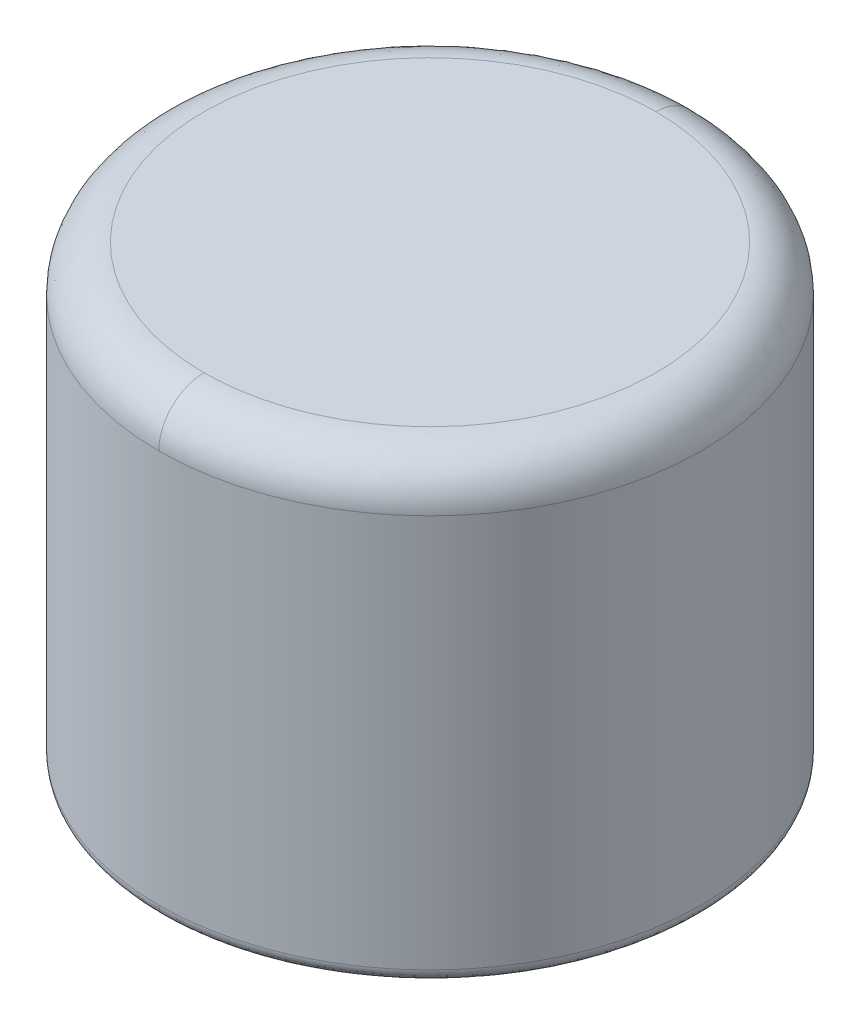
ISO-10303-21;
HEADER;
FILE_DESCRIPTION(('STEP AP214'),'2;1');
FILE_NAME('part.step','',(''),(''),'','','');
FILE_SCHEMA(('AUTOMOTIVE_DESIGN { 1 0 10303 214 1 1 1 1 }'));
ENDSEC;
DATA;
#1=APPLICATION_CONTEXT('core data for automotive mechanical design processes');
#2=APPLICATION_PROTOCOL_DEFINITION('international standard','automotive_design',2000,#1);
#3=PRODUCT_CONTEXT('',#1,'mechanical');
#4=PRODUCT('Part','Part','',(#3));
#5=PRODUCT_RELATED_PRODUCT_CATEGORY('part','',(#4));
#6=PRODUCT_DEFINITION_FORMATION('','',#4);
#7=PRODUCT_DEFINITION_CONTEXT('part definition',#1,'design');
#8=PRODUCT_DEFINITION('design','',#6,#7);
#9=PRODUCT_DEFINITION_SHAPE('','',#8);
#10=(LENGTH_UNIT() NAMED_UNIT(*) SI_UNIT(.MILLI.,.METRE.));
#11=(NAMED_UNIT(*) PLANE_ANGLE_UNIT() SI_UNIT($,.RADIAN.));
#12=(NAMED_UNIT(*) SI_UNIT($,.STERADIAN.) SOLID_ANGLE_UNIT());
#13=UNCERTAINTY_MEASURE_WITH_UNIT(LENGTH_MEASURE(1.E-05),#10,'distance_accuracy_value','');
#14=(GEOMETRIC_REPRESENTATION_CONTEXT(3) GLOBAL_UNCERTAINTY_ASSIGNED_CONTEXT((#13)) GLOBAL_UNIT_ASSIGNED_CONTEXT((#10,
#11,#12)) REPRESENTATION_CONTEXT('',''));
#15=CARTESIAN_POINT('',(0.,0.,0.));
#16=DIRECTION('',(0.,0.,1.));
#17=DIRECTION('',(1.,0.,0.));
#18=AXIS2_PLACEMENT_3D('',#15,#16,#17);
#19=CARTESIAN_POINT('',(-5.06,8.,-5.06));
#20=DIRECTION('',(0.,1.,0.));
#21=DIRECTION('',(0.,0.,1.));
#22=AXIS2_PLACEMENT_3D('',#19,#20,#21);
#23=PLANE('',#22);
#24=CARTESIAN_POINT('',(0.,8.,0.));
#25=DIRECTION('',(0.,-1.,0.));
#26=DIRECTION('',(0.,0.,-1.));
#27=AXIS2_PLACEMENT_3D('',#24,#25,#26);
#28=CIRCLE('',#27,5.);
#29=CARTESIAN_POINT('',(0.,8.,-5.));
#30=VERTEX_POINT('',#29);
#31=EDGE_CURVE('E20',#30,#30,#28,.T.);
#32=ORIENTED_EDGE('',*,*,#31,.T.);
#33=EDGE_LOOP('',(#32));
#34=FACE_BOUND('',#33,.T.);
#35=ADVANCED_FACE('F17',(#34),#23,.F.);
#36=CARTESIAN_POINT('',(0.,8.,0.));
#37=DIRECTION('',(0.,-1.,0.));
#38=DIRECTION('',(0.,0.,-1.));
#39=AXIS2_PLACEMENT_3D('',#36,#37,#38);
#40=CYLINDRICAL_SURFACE('',#39,5.);
#41=CARTESIAN_POINT('',(0.,0.299999999855515,0.));
#42=DIRECTION('',(0.,1.,0.));
#43=DIRECTION('',(0.,0.,1.));
#44=AXIS2_PLACEMENT_3D('',#41,#42,#43);
#45=CIRCLE('',#44,4.99999999961413);
#46=CARTESIAN_POINT('',(0.,0.299999999855529,-4.9999999997106));
#47=VERTEX_POINT('',#46);
#48=CARTESIAN_POINT('',(-3.84568813662381E-10,0.299999999855534,4.9999999997106));
#49=VERTEX_POINT('',#48);
#50=EDGE_CURVE('E303',#47,#49,#45,.T.);
#51=ORIENTED_EDGE('',*,*,#50,.F.);
#52=CARTESIAN_POINT('',(0.,0.299999999855572,0.));
#53=DIRECTION('',(0.,1.,0.));
#54=DIRECTION('',(-1.,0.,0.));
#55=AXIS2_PLACEMENT_3D('',#52,#53,#54);
#56=CIRCLE('',#55,4.99999999961413);
#57=EDGE_CURVE('E294',#49,#47,#56,.T.);
#58=ORIENTED_EDGE('',*,*,#57,.F.);
#59=EDGE_LOOP('',(#51,#58));
#60=FACE_BOUND('',#59,.T.);
#61=ORIENTED_EDGE('',*,*,#31,.F.);
#62=EDGE_LOOP('',(#61));
#63=FACE_BOUND('',#62,.T.);
#64=ADVANCED_FACE('F281',(#60,#63),#40,.F.);
#65=CARTESIAN_POINT('',(0.,0.00149875,5.329950025));
#66=CARTESIAN_POINT('',(10.65990005,0.00149875,5.329950025));
#67=CARTESIAN_POINT('',(10.65990005,0.00149875,-5.329950025));
#68=CARTESIAN_POINT('',(0.,0.00149875,-5.329950025));
#69=CARTESIAN_POINT('',(0.,-0.018966127,5.12598387));
#70=CARTESIAN_POINT('',(10.251967741,-0.018966127,5.12598387));
#71=CARTESIAN_POINT('',(10.251967741,-0.018966127,-5.12598387));
#72=CARTESIAN_POINT('',(0.,-0.018966127,-5.12598387));
#73=CARTESIAN_POINT('',(0.,0.12598387,4.981033873));
#74=CARTESIAN_POINT('',(9.962067746,0.12598387,4.981033873));
#75=CARTESIAN_POINT('',(9.962067746,0.12598387,-4.981033873));
#76=CARTESIAN_POINT('',(0.,0.12598387,-4.981033873));
#77=CARTESIAN_POINT('',(0.,0.329950025,5.00149875));
#78=CARTESIAN_POINT('',(10.002997501,0.329950025,5.00149875));
#79=CARTESIAN_POINT('',(10.002997501,0.329950025,-5.00149875));
#80=CARTESIAN_POINT('',(0.,0.329950025,-5.00149875));
#81=(BOUNDED_SURFACE() B_SPLINE_SURFACE(3,3,((#65,#66,#67,#68),(#69,#70,#71,#72),(#73,#74,#75,
#76),(#77,#78,#79,#80)),.UNSPECIFIED.,.F.,.F.,.F.) B_SPLINE_SURFACE_WITH_KNOTS((4,4),(4,4),(0.,
1.),(0.,1.),.UNSPECIFIED.) GEOMETRIC_REPRESENTATION_ITEM() RATIONAL_B_SPLINE_SURFACE(((1.,
0.333333333333333,0.333333333333333,1.),(0.755320871117972,0.251773623705991,0.251773623705991,
0.755320871117972),(0.755320871117972,0.251773623705991,0.251773623705991,0.755320871117972),
(1.,0.333333333333333,0.333333333333333,1.))) REPRESENTATION_ITEM('') SURFACE());
#82=CARTESIAN_POINT('',(0.,0.00149875,-5.329950025));
#83=CARTESIAN_POINT('',(0.,-0.018966127,-5.12598387));
#84=CARTESIAN_POINT('',(0.,0.12598387,-4.981033873));
#85=CARTESIAN_POINT('',(0.,0.329950025,-5.00149875));
#86=(BOUNDED_CURVE() B_SPLINE_CURVE(3,(#82,#83,#84,#85),.UNSPECIFIED.,.F.,
.F.) B_SPLINE_CURVE_WITH_KNOTS((4,4),(0.,1.),
.UNSPECIFIED.) CURVE() GEOMETRIC_REPRESENTATION_ITEM() RATIONAL_B_SPLINE_CURVE((1.,
0.755320871117972,0.755320871117972,1.)) REPRESENTATION_ITEM(''));
#87=CARTESIAN_POINT('',(0.,-2.31520357393311E-10,-5.30000000050654));
#88=VERTEX_POINT('',#87);
#89=EDGE_CURVE('E305',#88,#47,#86,.T.);
#90=CARTESIAN_POINT('',(0.,-3.85867262607881E-10,-5.30000000048663));
#91=CARTESIAN_POINT('',(10.6000000011048,-3.85867264559833E-10,-5.30000000048662));
#92=CARTESIAN_POINT('',(10.6000000011048,-3.85867264559833E-10,5.30000000048662));
#93=CARTESIAN_POINT('',(0.,-3.85867262607881E-10,5.30000000048663));
#94=(BOUNDED_CURVE() B_SPLINE_CURVE(3,(#90,#91,#92,#93),.UNSPECIFIED.,.F.,
.F.) B_SPLINE_CURVE_WITH_KNOTS((4,4),(0.,1.),
.UNSPECIFIED.) CURVE() GEOMETRIC_REPRESENTATION_ITEM() RATIONAL_B_SPLINE_CURVE((0.956578303063046,
0.318859434354348,0.318859434354348,0.956578303063046)) REPRESENTATION_ITEM(''));
#95=CARTESIAN_POINT('',(-1.08704849583849E-10,-2.3152035748196E-10,5.30000000050654));
#96=VERTEX_POINT('',#95);
#97=EDGE_CURVE('E133',#88,#96,#94,.T.);
#98=CARTESIAN_POINT('',(-5.4659567518212E-10,0.00149875,5.329950025));
#99=CARTESIAN_POINT('',(-5.25678590141867E-10,-0.018966127,5.12598387));
#100=CARTESIAN_POINT('',(-5.10813714978022E-10,0.12598387,4.981033873));
#101=CARTESIAN_POINT('',(-5.12912423874383E-10,0.329950025,5.00149875));
#102=(BOUNDED_CURVE() B_SPLINE_CURVE(3,(#98,#99,#100,#101),.UNSPECIFIED.,.F.,
.F.) B_SPLINE_CURVE_WITH_KNOTS((4,4),(0.,1.),
.UNSPECIFIED.) CURVE() GEOMETRIC_REPRESENTATION_ITEM() RATIONAL_B_SPLINE_CURVE((0.999999999897448,
0.755320871040513,0.755320871040513,0.999999999897448)) REPRESENTATION_ITEM(''));
#103=EDGE_CURVE('E258',#49,#96,#102,.F.);
#104=ORIENTED_EDGE('',*,*,#57,.T.);
#105=ORIENTED_EDGE('',*,*,#89,.F.);
#106=ORIENTED_EDGE('',*,*,#97,.T.);
#107=ORIENTED_EDGE('',*,*,#103,.F.);
#108=EDGE_LOOP('',(#104,#105,#106,#107));
#109=FACE_BOUND('',#108,.T.);
#110=ADVANCED_FACE('F271',(#109),#81,.T.);
#111=CARTESIAN_POINT('',(0.,0.00149875,-5.329950025));
#112=CARTESIAN_POINT('',(-10.65990005,0.00149875,-5.329950025));
#113=CARTESIAN_POINT('',(-10.65990005,0.00149875,5.329950025));
#114=CARTESIAN_POINT('',(0.,0.00149875,5.329950025));
#115=CARTESIAN_POINT('',(0.,-0.018966127,-5.12598387));
#116=CARTESIAN_POINT('',(-10.251967741,-0.018966127,-5.12598387));
#117=CARTESIAN_POINT('',(-10.251967741,-0.018966127,5.12598387));
#118=CARTESIAN_POINT('',(0.,-0.018966127,5.12598387));
#119=CARTESIAN_POINT('',(0.,0.12598387,-4.981033873));
#120=CARTESIAN_POINT('',(-9.962067746,0.12598387,-4.981033873));
#121=CARTESIAN_POINT('',(-9.962067746,0.12598387,4.981033873));
#122=CARTESIAN_POINT('',(0.,0.12598387,4.981033873));
#123=CARTESIAN_POINT('',(0.,0.329950025,-5.00149875));
#124=CARTESIAN_POINT('',(-10.002997501,0.329950025,-5.00149875));
#125=CARTESIAN_POINT('',(-10.002997501,0.329950025,5.00149875));
#126=CARTESIAN_POINT('',(0.,0.329950025,5.00149875));
#127=(BOUNDED_SURFACE() B_SPLINE_SURFACE(3,3,((#111,#112,#113,#114),(#115,#116,#117,#118),(#119,
#120,#121,#122),(#123,#124,#125,#126)),.UNSPECIFIED.,.F.,.F.,
.F.) B_SPLINE_SURFACE_WITH_KNOTS((4,4),(4,4),(0.,1.),(0.,1.),
.UNSPECIFIED.) GEOMETRIC_REPRESENTATION_ITEM() RATIONAL_B_SPLINE_SURFACE(((1.,0.333333333333333,
0.333333333333333,1.),(0.755320871117972,0.251773623705991,0.251773623705991,0.755320871117972),
(0.755320871117972,0.251773623705991,0.251773623705991,0.755320871117972),(1.,0.333333333333333,
0.333333333333333,1.))) REPRESENTATION_ITEM('') SURFACE());
#128=CARTESIAN_POINT('',(0.,-3.85867262579394E-10,5.30000000048663));
#129=CARTESIAN_POINT('',(-10.6000000011048,-3.85867264555239E-10,5.30000000048662));
#130=CARTESIAN_POINT('',(-10.6000000011048,-3.85867264555239E-10,-5.30000000048662));
#131=CARTESIAN_POINT('',(0.,-3.85867262579394E-10,-5.30000000048663));
#132=(BOUNDED_CURVE() B_SPLINE_CURVE(3,(#128,#129,#130,#131),.UNSPECIFIED.,.F.,
.F.) B_SPLINE_CURVE_WITH_KNOTS((4,4),(0.,1.),
.UNSPECIFIED.) CURVE() GEOMETRIC_REPRESENTATION_ITEM() RATIONAL_B_SPLINE_CURVE((0.956578303063048,
0.318859434354349,0.318859434354349,0.956578303063048)) REPRESENTATION_ITEM(''));
#133=EDGE_CURVE('E254',#96,#88,#132,.T.);
#134=ORIENTED_EDGE('',*,*,#89,.T.);
#135=ORIENTED_EDGE('',*,*,#50,.T.);
#136=ORIENTED_EDGE('',*,*,#103,.T.);
#137=ORIENTED_EDGE('',*,*,#133,.T.);
#138=EDGE_LOOP('',(#134,#135,#136,#137));
#139=FACE_BOUND('',#138,.T.);
#140=ADVANCED_FACE('F260',(#139),#127,.T.);
#141=CARTESIAN_POINT('',(-5.06,10.,-5.06));
#142=DIRECTION('',(0.,1.,0.));
#143=DIRECTION('',(0.,0.,1.));
#144=AXIS2_PLACEMENT_3D('',#141,#142,#143);
#145=PLANE('',#144);
#146=CARTESIAN_POINT('',(0.,9.99999999979495,-4.99999999878838));
#147=CARTESIAN_POINT('',(9.99999999842778,9.99999999979495,-4.99999999878838));
#148=CARTESIAN_POINT('',(9.99999999842778,9.99999999979495,4.99999999878838));
#149=CARTESIAN_POINT('',(0.,9.99999999979495,4.99999999878838));
#150=(BOUNDED_CURVE() B_SPLINE_CURVE(3,(#146,#147,#148,#149),.UNSPECIFIED.,.F.,
.F.) B_SPLINE_CURVE_WITH_KNOTS((4,4),(0.,1.),
.UNSPECIFIED.) CURVE() GEOMETRIC_REPRESENTATION_ITEM() RATIONAL_B_SPLINE_CURVE((0.956578302698841,
0.318859434232947,0.318859434232947,0.956578302698841)) REPRESENTATION_ITEM(''));
#151=CARTESIAN_POINT('',(0.,9.99999999987697,-4.99999999891675));
#152=VERTEX_POINT('',#151);
#153=CARTESIAN_POINT('',(0.,9.99999999987697,4.99999999891675));
#154=VERTEX_POINT('',#153);
#155=EDGE_CURVE('E121',#152,#154,#150,.T.);
#156=ORIENTED_EDGE('',*,*,#155,.F.);
#157=CARTESIAN_POINT('',(0.,9.99999999979495,4.99999999878838));
#158=CARTESIAN_POINT('',(-9.99999999842778,9.99999999979495,4.99999999878838));
#159=CARTESIAN_POINT('',(-9.99999999842778,9.99999999979495,-4.99999999878838));
#160=CARTESIAN_POINT('',(0.,9.99999999979495,-4.99999999878838));
#161=(BOUNDED_CURVE() B_SPLINE_CURVE(3,(#157,#158,#159,#160),.UNSPECIFIED.,.F.,
.F.) B_SPLINE_CURVE_WITH_KNOTS((4,4),(0.,1.),
.UNSPECIFIED.) CURVE() GEOMETRIC_REPRESENTATION_ITEM() RATIONAL_B_SPLINE_CURVE((0.956578302698841,
0.318859434232947,0.318859434232947,0.956578302698841)) REPRESENTATION_ITEM(''));
#162=EDGE_CURVE('E75',#154,#152,#161,.T.);
#163=ORIENTED_EDGE('',*,*,#162,.F.);
#164=EDGE_LOOP('',(#156,#163));
#165=FACE_BOUND('',#164,.T.);
#166=ADVANCED_FACE('F149',(#165),#145,.T.);
#167=CARTESIAN_POINT('',(-5.7684,0.,-5.7684));
#168=DIRECTION('',(0.,1.,0.));
#169=DIRECTION('',(0.,0.,1.));
#170=AXIS2_PLACEMENT_3D('',#167,#168,#169);
#171=PLANE('',#170);
#172=CARTESIAN_POINT('',(0.,-3.85867261610921E-10,-5.69999999903113));
#173=CARTESIAN_POINT('',(-11.3999999979307,-3.85867263802283E-10,-5.69999999903113));
#174=CARTESIAN_POINT('',(-11.3999999979307,-3.85867263802283E-10,5.69999999903113));
#175=CARTESIAN_POINT('',(0.,-3.85867261610921E-10,5.69999999903113));
#176=(BOUNDED_CURVE() B_SPLINE_CURVE(3,(#172,#173,#174,#175),.UNSPECIFIED.,.F.,
.F.) B_SPLINE_CURVE_WITH_KNOTS((4,4),(0.,1.),
.UNSPECIFIED.) CURVE() GEOMETRIC_REPRESENTATION_ITEM() RATIONAL_B_SPLINE_CURVE((0.956578303699982,
0.31885943456666,0.31885943456666,0.956578303699982)) REPRESENTATION_ITEM(''));
#177=CARTESIAN_POINT('',(0.,-2.31520356977979E-10,-5.69999999901122));
#178=VERTEX_POINT('',#177);
#179=CARTESIAN_POINT('',(0.,-2.31520356953474E-10,5.69999999901122));
#180=VERTEX_POINT('',#179);
#181=EDGE_CURVE('E232',#178,#180,#176,.T.);
#182=ORIENTED_EDGE('',*,*,#181,.F.);
#183=CARTESIAN_POINT('',(0.,-3.85867261571644E-10,5.69999999903113));
#184=CARTESIAN_POINT('',(11.3999999979307,-3.85867263597305E-10,5.69999999903113));
#185=CARTESIAN_POINT('',(11.3999999979307,-3.85867263597305E-10,-5.69999999903113));
#186=CARTESIAN_POINT('',(0.,-3.85867261571644E-10,-5.69999999903113));
#187=(BOUNDED_CURVE() B_SPLINE_CURVE(3,(#183,#184,#185,#186),.UNSPECIFIED.,.F.,
.F.) B_SPLINE_CURVE_WITH_KNOTS((4,4),(0.,1.),
.UNSPECIFIED.) CURVE() GEOMETRIC_REPRESENTATION_ITEM() RATIONAL_B_SPLINE_CURVE((0.95657830369998,
0.31885943456666,0.31885943456666,0.95657830369998)) REPRESENTATION_ITEM(''));
#188=EDGE_CURVE('E90',#180,#178,#187,.T.);
#189=ORIENTED_EDGE('',*,*,#188,.F.);
#190=EDGE_LOOP('',(#182,#189));
#191=FACE_BOUND('',#190,.T.);
#192=ORIENTED_EDGE('',*,*,#97,.F.);
#193=ORIENTED_EDGE('',*,*,#133,.F.);
#194=EDGE_LOOP('',(#192,#193));
#195=FACE_BOUND('',#194,.T.);
#196=ADVANCED_FACE('F139',(#191,#195),#171,.F.);
#197=CARTESIAN_POINT('',(0.,9.995004165,-4.900166583));
#198=CARTESIAN_POINT('',(-9.800333167,9.995004165,-4.900166583));
#199=CARTESIAN_POINT('',(-9.800333167,9.995004165,4.900166583));
#200=CARTESIAN_POINT('',(0.,9.995004165,4.900166583));
#201=CARTESIAN_POINT('',(0.,10.063220423,-5.580053765));
#202=CARTESIAN_POINT('',(-11.16010753,10.063220423,-5.580053765));
#203=CARTESIAN_POINT('',(-11.16010753,10.063220423,5.580053765));
#204=CARTESIAN_POINT('',(0.,10.063220423,5.580053765));
#205=CARTESIAN_POINT('',(0.,9.580053765,-6.063220423));
#206=CARTESIAN_POINT('',(-12.126440845,9.580053765,-6.063220423));
#207=CARTESIAN_POINT('',(-12.126440845,9.580053765,6.063220423));
#208=CARTESIAN_POINT('',(0.,9.580053765,6.063220423));
#209=CARTESIAN_POINT('',(0.,8.900166583,-5.995004165));
#210=CARTESIAN_POINT('',(-11.990008331,8.900166583,-5.995004165));
#211=CARTESIAN_POINT('',(-11.990008331,8.900166583,5.995004165));
#212=CARTESIAN_POINT('',(0.,8.900166583,5.995004165));
#213=(BOUNDED_SURFACE() B_SPLINE_SURFACE(3,3,((#197,#198,#199,#200),(#201,#202,#203,#204),(#205,
#206,#207,#208),(#209,#210,#211,#212)),.UNSPECIFIED.,.F.,.F.,
.F.) B_SPLINE_SURFACE_WITH_KNOTS((4,4),(4,4),(0.,1.),(0.,1.),
.UNSPECIFIED.) GEOMETRIC_REPRESENTATION_ITEM() RATIONAL_B_SPLINE_SURFACE(((1.,0.333333333333333,
0.333333333333333,1.),(0.755320871117972,0.251773623705991,0.251773623705991,0.755320871117972),
(0.755320871117972,0.251773623705991,0.251773623705991,0.755320871117972),(1.,0.333333333333333,
0.333333333333333,1.))) REPRESENTATION_ITEM('') SURFACE());
#214=CARTESIAN_POINT('',(0.,9.995004165,-4.900166583));
#215=CARTESIAN_POINT('',(0.,10.063220423,-5.580053765));
#216=CARTESIAN_POINT('',(0.,9.580053765,-6.063220423));
#217=CARTESIAN_POINT('',(0.,8.900166583,-5.995004165));
#218=(BOUNDED_CURVE() B_SPLINE_CURVE(3,(#214,#215,#216,#217),.UNSPECIFIED.,.F.,
.F.) B_SPLINE_CURVE_WITH_KNOTS((4,4),(0.,1.),
.UNSPECIFIED.) CURVE() GEOMETRIC_REPRESENTATION_ITEM() RATIONAL_B_SPLINE_CURVE((1.,
0.755320871117972,0.755320871117972,1.)) REPRESENTATION_ITEM(''));
#219=CARTESIAN_POINT('',(0.,9.00000000013323,-5.99999999989747));
#220=VERTEX_POINT('',#219);
#221=EDGE_CURVE('E72',#220,#152,#218,.F.);
#222=CARTESIAN_POINT('',(0.,9.00000000013318,0.));
#223=DIRECTION('',(0.,-1.,0.));
#224=DIRECTION('',(0.,0.,-1.));
#225=AXIS2_PLACEMENT_3D('',#222,#223,#224);
#226=CIRCLE('',#225,6.);
#227=CARTESIAN_POINT('',(-4.614823008412E-10,9.00000000013321,5.99999999994874));
#228=VERTEX_POINT('',#227);
#229=EDGE_CURVE('E68',#228,#220,#226,.T.);
#230=CARTESIAN_POINT('',(0.,9.995004165,4.900166583));
#231=CARTESIAN_POINT('',(0.,10.063220423,5.580053765));
#232=CARTESIAN_POINT('',(0.,9.580053765,6.063220423));
#233=CARTESIAN_POINT('',(0.,8.900166583,5.995004165));
#234=(BOUNDED_CURVE() B_SPLINE_CURVE(3,(#230,#231,#232,#233),.UNSPECIFIED.,.F.,
.F.) B_SPLINE_CURVE_WITH_KNOTS((4,4),(0.,1.),
.UNSPECIFIED.) CURVE() GEOMETRIC_REPRESENTATION_ITEM() RATIONAL_B_SPLINE_CURVE((1.,
0.755320871117972,0.755320871117972,1.)) REPRESENTATION_ITEM(''));
#235=EDGE_CURVE('E80',#154,#228,#234,.T.);
#236=ORIENTED_EDGE('',*,*,#221,.F.);
#237=ORIENTED_EDGE('',*,*,#229,.F.);
#238=ORIENTED_EDGE('',*,*,#235,.F.);
#239=ORIENTED_EDGE('',*,*,#162,.T.);
#240=EDGE_LOOP('',(#236,#237,#238,#239));
#241=FACE_BOUND('',#240,.T.);
#242=ADVANCED_FACE('F74',(#241),#213,.T.);
#243=CARTESIAN_POINT('',(0.,0.329950025,-5.99850125));
#244=CARTESIAN_POINT('',(-11.997002499,0.329950025,-5.99850125));
#245=CARTESIAN_POINT('',(-11.997002499,0.329950025,5.99850125));
#246=CARTESIAN_POINT('',(0.,0.329950025,5.99850125));
#247=CARTESIAN_POINT('',(0.,0.12598387,-6.018966127));
#248=CARTESIAN_POINT('',(-12.037932254,0.12598387,-6.018966127));
#249=CARTESIAN_POINT('',(-12.037932254,0.12598387,6.018966127));
#250=CARTESIAN_POINT('',(0.,0.12598387,6.018966127));
#251=CARTESIAN_POINT('',(0.,-0.018966127,-5.87401613));
#252=CARTESIAN_POINT('',(-11.748032259,-0.018966127,-5.87401613));
#253=CARTESIAN_POINT('',(-11.748032259,-0.018966127,5.87401613));
#254=CARTESIAN_POINT('',(0.,-0.018966127,5.87401613));
#255=CARTESIAN_POINT('',(0.,0.00149875,-5.670049975));
#256=CARTESIAN_POINT('',(-11.34009995,0.00149875,-5.670049975));
#257=CARTESIAN_POINT('',(-11.34009995,0.00149875,5.670049975));
#258=CARTESIAN_POINT('',(0.,0.00149875,5.670049975));
#259=(BOUNDED_SURFACE() B_SPLINE_SURFACE(3,3,((#243,#244,#245,#246),(#247,#248,#249,#250),(#251,
#252,#253,#254),(#255,#256,#257,#258)),.UNSPECIFIED.,.F.,.F.,
.F.) B_SPLINE_SURFACE_WITH_KNOTS((4,4),(4,4),(0.,1.),(0.,1.),
.UNSPECIFIED.) GEOMETRIC_REPRESENTATION_ITEM() RATIONAL_B_SPLINE_SURFACE(((1.,0.333333333333333,
0.333333333333333,1.),(0.755320871117972,0.251773623705991,0.251773623705991,0.755320871117972),
(0.755320871117972,0.251773623705991,0.251773623705991,0.755320871117972),(1.,0.333333333333333,
0.333333333333333,1.))) REPRESENTATION_ITEM('') SURFACE());
#260=CARTESIAN_POINT('',(0.,0.329950025,-5.99850125));
#261=CARTESIAN_POINT('',(0.,0.12598387,-6.018966127));
#262=CARTESIAN_POINT('',(0.,-0.018966127,-5.87401613));
#263=CARTESIAN_POINT('',(0.,0.00149875,-5.670049975));
#264=(BOUNDED_CURVE() B_SPLINE_CURVE(3,(#260,#261,#262,#263),.UNSPECIFIED.,.F.,
.F.) B_SPLINE_CURVE_WITH_KNOTS((4,4),(0.,1.),
.UNSPECIFIED.) CURVE() GEOMETRIC_REPRESENTATION_ITEM() RATIONAL_B_SPLINE_CURVE((1.,
0.755320871117972,0.755320871117972,1.)) REPRESENTATION_ITEM(''));
#265=CARTESIAN_POINT('',(0.,0.299999999867579,-6.00000000019293));
#266=VERTEX_POINT('',#265);
#267=EDGE_CURVE('E87',#178,#266,#264,.F.);
#268=CARTESIAN_POINT('',(0.,0.329950025,5.99850125));
#269=CARTESIAN_POINT('',(0.,0.12598387,6.018966127));
#270=CARTESIAN_POINT('',(0.,-0.018966127,5.87401613));
#271=CARTESIAN_POINT('',(0.,0.00149875,5.670049975));
#272=(BOUNDED_CURVE() B_SPLINE_CURVE(3,(#268,#269,#270,#271),.UNSPECIFIED.,.F.,
.F.) B_SPLINE_CURVE_WITH_KNOTS((4,4),(0.,1.),
.UNSPECIFIED.) CURVE() GEOMETRIC_REPRESENTATION_ITEM() RATIONAL_B_SPLINE_CURVE((1.,
0.755320871117972,0.755320871117972,1.)) REPRESENTATION_ITEM(''));
#273=CARTESIAN_POINT('',(-4.614823008412E-10,0.29999999986159,6.00000000009647));
#274=VERTEX_POINT('',#273);
#275=EDGE_CURVE('E79',#274,#180,#272,.T.);
#276=CARTESIAN_POINT('',(0.,0.299999999879643,0.));
#277=DIRECTION('',(0.,-1.,0.));
#278=DIRECTION('',(0.,0.,-1.));
#279=AXIS2_PLACEMENT_3D('',#276,#277,#278);
#280=CIRCLE('',#279,6.);
#281=EDGE_CURVE('E34',#266,#274,#280,.F.);
#282=ORIENTED_EDGE('',*,*,#267,.F.);
#283=ORIENTED_EDGE('',*,*,#181,.T.);
#284=ORIENTED_EDGE('',*,*,#275,.F.);
#285=ORIENTED_EDGE('',*,*,#281,.F.);
#286=EDGE_LOOP('',(#282,#283,#284,#285));
#287=FACE_BOUND('',#286,.T.);
#288=ADVANCED_FACE('F211',(#287),#259,.T.);
#289=CARTESIAN_POINT('',(0.,9.995004165,4.900166583));
#290=CARTESIAN_POINT('',(9.800333167,9.995004165,4.900166583));
#291=CARTESIAN_POINT('',(9.800333167,9.995004165,-4.900166583));
#292=CARTESIAN_POINT('',(0.,9.995004165,-4.900166583));
#293=CARTESIAN_POINT('',(0.,10.063220423,5.580053765));
#294=CARTESIAN_POINT('',(11.16010753,10.063220423,5.580053765));
#295=CARTESIAN_POINT('',(11.16010753,10.063220423,-5.580053765));
#296=CARTESIAN_POINT('',(0.,10.063220423,-5.580053765));
#297=CARTESIAN_POINT('',(0.,9.580053765,6.063220423));
#298=CARTESIAN_POINT('',(12.126440845,9.580053765,6.063220423));
#299=CARTESIAN_POINT('',(12.126440845,9.580053765,-6.063220423));
#300=CARTESIAN_POINT('',(0.,9.580053765,-6.063220423));
#301=CARTESIAN_POINT('',(0.,8.900166583,5.995004165));
#302=CARTESIAN_POINT('',(11.990008331,8.900166583,5.995004165));
#303=CARTESIAN_POINT('',(11.990008331,8.900166583,-5.995004165));
#304=CARTESIAN_POINT('',(0.,8.900166583,-5.995004165));
#305=(BOUNDED_SURFACE() B_SPLINE_SURFACE(3,3,((#289,#290,#291,#292),(#293,#294,#295,#296),(#297,
#298,#299,#300),(#301,#302,#303,#304)),.UNSPECIFIED.,.F.,.F.,
.F.) B_SPLINE_SURFACE_WITH_KNOTS((4,4),(4,4),(0.,1.),(0.,1.),
.UNSPECIFIED.) GEOMETRIC_REPRESENTATION_ITEM() RATIONAL_B_SPLINE_SURFACE(((1.,0.333333333333333,
0.333333333333333,1.),(0.755320871117972,0.251773623705991,0.251773623705991,0.755320871117972),
(0.755320871117972,0.251773623705991,0.251773623705991,0.755320871117972),(1.,0.333333333333333,
0.333333333333333,1.))) REPRESENTATION_ITEM('') SURFACE());
#306=CARTESIAN_POINT('',(0.,9.00000000013318,0.));
#307=DIRECTION('',(0.,-1.,0.));
#308=DIRECTION('',(0.,0.,-1.));
#309=AXIS2_PLACEMENT_3D('',#306,#307,#308);
#310=CIRCLE('',#309,6.);
#311=EDGE_CURVE('E26',#220,#228,#310,.T.);
#312=ORIENTED_EDGE('',*,*,#311,.F.);
#313=ORIENTED_EDGE('',*,*,#221,.T.);
#314=ORIENTED_EDGE('',*,*,#155,.T.);
#315=ORIENTED_EDGE('',*,*,#235,.T.);
#316=EDGE_LOOP('',(#312,#313,#314,#315));
#317=FACE_BOUND('',#316,.T.);
#318=ADVANCED_FACE('F83',(#317),#305,.T.);
#319=CARTESIAN_POINT('',(0.,0.329950025,5.99850125));
#320=CARTESIAN_POINT('',(11.997002499,0.329950025,5.99850125));
#321=CARTESIAN_POINT('',(11.997002499,0.329950025,-5.99850125));
#322=CARTESIAN_POINT('',(0.,0.329950025,-5.99850125));
#323=CARTESIAN_POINT('',(0.,0.12598387,6.018966127));
#324=CARTESIAN_POINT('',(12.037932254,0.12598387,6.018966127));
#325=CARTESIAN_POINT('',(12.037932254,0.12598387,-6.018966127));
#326=CARTESIAN_POINT('',(0.,0.12598387,-6.018966127));
#327=CARTESIAN_POINT('',(0.,-0.018966127,5.87401613));
#328=CARTESIAN_POINT('',(11.748032259,-0.018966127,5.87401613));
#329=CARTESIAN_POINT('',(11.748032259,-0.018966127,-5.87401613));
#330=CARTESIAN_POINT('',(0.,-0.018966127,-5.87401613));
#331=CARTESIAN_POINT('',(0.,0.00149875,5.670049975));
#332=CARTESIAN_POINT('',(11.34009995,0.00149875,5.670049975));
#333=CARTESIAN_POINT('',(11.34009995,0.00149875,-5.670049975));
#334=CARTESIAN_POINT('',(0.,0.00149875,-5.670049975));
#335=(BOUNDED_SURFACE() B_SPLINE_SURFACE(3,3,((#319,#320,#321,#322),(#323,#324,#325,#326),(#327,
#328,#329,#330),(#331,#332,#333,#334)),.UNSPECIFIED.,.F.,.F.,
.F.) B_SPLINE_SURFACE_WITH_KNOTS((4,4),(4,4),(0.,1.),(0.,1.),
.UNSPECIFIED.) GEOMETRIC_REPRESENTATION_ITEM() RATIONAL_B_SPLINE_SURFACE(((1.,0.333333333333333,
0.333333333333333,1.),(0.755320871117972,0.251773623705991,0.251773623705991,0.755320871117972),
(0.755320871117972,0.251773623705991,0.251773623705991,0.755320871117972),(1.,0.333333333333333,
0.333333333333333,1.))) REPRESENTATION_ITEM('') SURFACE());
#336=CARTESIAN_POINT('',(0.,0.299999999855572,0.));
#337=DIRECTION('',(0.,-1.,0.));
#338=DIRECTION('',(0.,0.,-1.));
#339=AXIS2_PLACEMENT_3D('',#336,#337,#338);
#340=CIRCLE('',#339,6.);
#341=EDGE_CURVE('E11',#274,#266,#340,.F.);
#342=ORIENTED_EDGE('',*,*,#188,.T.);
#343=ORIENTED_EDGE('',*,*,#267,.T.);
#344=ORIENTED_EDGE('',*,*,#341,.F.);
#345=ORIENTED_EDGE('',*,*,#275,.T.);
#346=EDGE_LOOP('',(#342,#343,#344,#345));
#347=FACE_BOUND('',#346,.T.);
#348=ADVANCED_FACE('F190',(#347),#335,.T.);
#349=CARTESIAN_POINT('',(0.,9.,0.));
#350=DIRECTION('',(0.,-1.,0.));
#351=DIRECTION('',(0.,0.,-1.));
#352=AXIS2_PLACEMENT_3D('',#349,#350,#351);
#353=CYLINDRICAL_SURFACE('',#352,6.);
#354=ORIENTED_EDGE('',*,*,#281,.T.);
#355=ORIENTED_EDGE('',*,*,#341,.T.);
#356=EDGE_LOOP('',(#354,#355));
#357=FACE_BOUND('',#356,.T.);
#358=ORIENTED_EDGE('',*,*,#311,.T.);
#359=ORIENTED_EDGE('',*,*,#229,.T.);
#360=EDGE_LOOP('',(#358,#359));
#361=FACE_BOUND('',#360,.T.);
#362=ADVANCED_FACE('F86',(#357,#361),#353,.T.);
#363=CLOSED_SHELL('',(#35,#64,#110,#140,#166,#196,#242,#288,#318,#348,#362));
#364=MANIFOLD_SOLID_BREP('B1',#363);
#365=ADVANCED_BREP_SHAPE_REPRESENTATION('',(#18,#364),#14);
#366=SHAPE_DEFINITION_REPRESENTATION(#9,#365);
ENDSEC;
END-ISO-10303-21;
